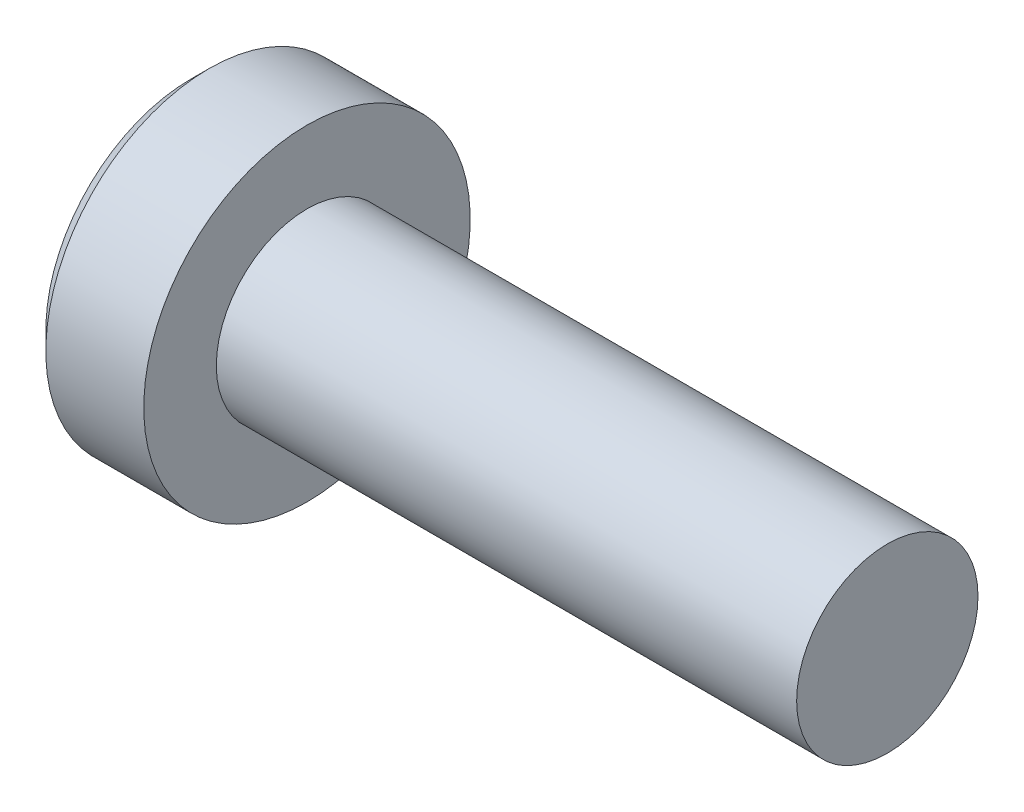
ISO-10303-21;
HEADER;
FILE_DESCRIPTION(('STEP AP214'),'2;1');
FILE_NAME('part.step','',(''),(''),'','','');
FILE_SCHEMA(('AUTOMOTIVE_DESIGN { 1 0 10303 214 1 1 1 1 }'));
ENDSEC;
DATA;
#1=APPLICATION_CONTEXT('core data for automotive mechanical design processes');
#2=APPLICATION_PROTOCOL_DEFINITION('international standard','automotive_design',2000,#1);
#3=PRODUCT_CONTEXT('',#1,'mechanical');
#4=PRODUCT('Part','Part','',(#3));
#5=PRODUCT_RELATED_PRODUCT_CATEGORY('part','',(#4));
#6=PRODUCT_DEFINITION_FORMATION('','',#4);
#7=PRODUCT_DEFINITION_CONTEXT('part definition',#1,'design');
#8=PRODUCT_DEFINITION('design','',#6,#7);
#9=PRODUCT_DEFINITION_SHAPE('','',#8);
#10=(LENGTH_UNIT() NAMED_UNIT(*) SI_UNIT(.MILLI.,.METRE.));
#11=(NAMED_UNIT(*) PLANE_ANGLE_UNIT() SI_UNIT($,.RADIAN.));
#12=(NAMED_UNIT(*) SI_UNIT($,.STERADIAN.) SOLID_ANGLE_UNIT());
#13=UNCERTAINTY_MEASURE_WITH_UNIT(LENGTH_MEASURE(1.E-05),#10,'distance_accuracy_value','');
#14=(GEOMETRIC_REPRESENTATION_CONTEXT(3) GLOBAL_UNCERTAINTY_ASSIGNED_CONTEXT((#13)) GLOBAL_UNIT_ASSIGNED_CONTEXT((#10,
#11,#12)) REPRESENTATION_CONTEXT('',''));
#15=CARTESIAN_POINT('',(0.,0.,0.));
#16=DIRECTION('',(0.,0.,1.));
#17=DIRECTION('',(1.,0.,0.));
#18=AXIS2_PLACEMENT_3D('',#15,#16,#17);
#19=CARTESIAN_POINT('',(-0.5,0.,0.));
#20=DIRECTION('',(-1.,0.,0.));
#21=DIRECTION('',(0.,0.,1.));
#22=AXIS2_PLACEMENT_3D('',#19,#20,#21);
#23=PLANE('',#22);
#24=CARTESIAN_POINT('',(-0.5,0.,0.));
#25=DIRECTION('',(-1.,0.,0.));
#26=DIRECTION('',(0.,-1.,0.));
#27=AXIS2_PLACEMENT_3D('',#24,#25,#26);
#28=CIRCLE('',#27,1.);
#29=CARTESIAN_POINT('',(-0.5,-0.866025403784439,0.5));
#30=VERTEX_POINT('',#29);
#31=CARTESIAN_POINT('',(-0.5,0.,1.));
#32=VERTEX_POINT('',#31);
#33=EDGE_CURVE('E185',#30,#32,#28,.T.);
#34=ORIENTED_EDGE('',*,*,#33,.F.);
#35=DIRECTION('',(0.,0.5,0.866025403784439));
#36=VECTOR('',#35,1.);
#37=CARTESIAN_POINT('',(-0.5,-1.15470053837925,0.));
#38=LINE('',#37,#36);
#39=CARTESIAN_POINT('',(-0.5,-0.577350269189627,0.999999999999999));
#40=VERTEX_POINT('',#39);
#41=EDGE_CURVE('E245',#30,#40,#38,.T.);
#42=ORIENTED_EDGE('',*,*,#41,.T.);
#43=DIRECTION('',(0.,1.,0.));
#44=VECTOR('',#43,1.);
#45=CARTESIAN_POINT('',(-0.5,-0.577350269189627,0.999999999999999));
#46=LINE('',#45,#44);
#47=EDGE_CURVE('E204',#40,#32,#46,.T.);
#48=ORIENTED_EDGE('',*,*,#47,.T.);
#49=EDGE_LOOP('',(#34,#42,#48));
#50=FACE_BOUND('',#49,.T.);
#51=ADVANCED_FACE('F36',(#50),#23,.T.);
#52=CARTESIAN_POINT('',(-0.5,0.866025403784439,0.5));
#53=VERTEX_POINT('',#52);
#54=EDGE_CURVE('E191',#32,#53,#28,.T.);
#55=ORIENTED_EDGE('',*,*,#54,.F.);
#56=CARTESIAN_POINT('',(-0.5,0.577350269189627,0.999999999999999));
#57=VERTEX_POINT('',#56);
#58=EDGE_CURVE('E238',#32,#57,#46,.T.);
#59=ORIENTED_EDGE('',*,*,#58,.T.);
#60=DIRECTION('',(0.,0.5,-0.866025403784439));
#61=VECTOR('',#60,1.);
#62=CARTESIAN_POINT('',(-0.5,0.577350269189627,0.999999999999999));
#63=LINE('',#62,#61);
#64=EDGE_CURVE('E259',#57,#53,#63,.T.);
#65=ORIENTED_EDGE('',*,*,#64,.T.);
#66=EDGE_LOOP('',(#55,#59,#65));
#67=FACE_BOUND('',#66,.T.);
#68=ADVANCED_FACE('F123',(#67),#23,.T.);
#69=CARTESIAN_POINT('',(-0.5,0.866025403784439,-0.5));
#70=VERTEX_POINT('',#69);
#71=EDGE_CURVE('E193',#53,#70,#28,.T.);
#72=ORIENTED_EDGE('',*,*,#71,.F.);
#73=CARTESIAN_POINT('',(-0.5,1.15470053837925,0.));
#74=VERTEX_POINT('',#73);
#75=EDGE_CURVE('E218',#53,#74,#63,.T.);
#76=ORIENTED_EDGE('',*,*,#75,.T.);
#77=DIRECTION('',(0.,-0.5,-0.866025403784439));
#78=VECTOR('',#77,1.);
#79=CARTESIAN_POINT('',(-0.5,1.15470053837925,0.));
#80=LINE('',#79,#78);
#81=EDGE_CURVE('E256',#74,#70,#80,.T.);
#82=ORIENTED_EDGE('',*,*,#81,.T.);
#83=EDGE_LOOP('',(#72,#76,#82));
#84=FACE_BOUND('',#83,.T.);
#85=ADVANCED_FACE('F128',(#84),#23,.T.);
#86=CARTESIAN_POINT('',(-0.5,0.,-1.));
#87=VERTEX_POINT('',#86);
#88=EDGE_CURVE('E196',#70,#87,#28,.T.);
#89=ORIENTED_EDGE('',*,*,#88,.F.);
#90=CARTESIAN_POINT('',(-0.5,0.577350269189626,-1.));
#91=VERTEX_POINT('',#90);
#92=EDGE_CURVE('E258',#70,#91,#80,.T.);
#93=ORIENTED_EDGE('',*,*,#92,.T.);
#94=DIRECTION('',(0.,-1.,0.));
#95=VECTOR('',#94,1.);
#96=CARTESIAN_POINT('',(-0.5,0.577350269189626,-1.));
#97=LINE('',#96,#95);
#98=EDGE_CURVE('E252',#91,#87,#97,.T.);
#99=ORIENTED_EDGE('',*,*,#98,.T.);
#100=EDGE_LOOP('',(#89,#93,#99));
#101=FACE_BOUND('',#100,.T.);
#102=ADVANCED_FACE('F175',(#101),#23,.T.);
#103=CARTESIAN_POINT('',(-0.5,-0.866025403784439,-0.5));
#104=VERTEX_POINT('',#103);
#105=EDGE_CURVE('E51',#87,#104,#28,.T.);
#106=ORIENTED_EDGE('',*,*,#105,.F.);
#107=CARTESIAN_POINT('',(-0.5,-0.577350269189626,-1.));
#108=VERTEX_POINT('',#107);
#109=EDGE_CURVE('E255',#87,#108,#97,.T.);
#110=ORIENTED_EDGE('',*,*,#109,.T.);
#111=DIRECTION('',(0.,-0.5,0.866025403784439));
#112=VECTOR('',#111,1.);
#113=CARTESIAN_POINT('',(-0.5,-0.577350269189626,-1.));
#114=LINE('',#113,#112);
#115=EDGE_CURVE('E247',#108,#104,#114,.T.);
#116=ORIENTED_EDGE('',*,*,#115,.T.);
#117=EDGE_LOOP('',(#106,#110,#116));
#118=FACE_BOUND('',#117,.T.);
#119=ADVANCED_FACE('F121',(#118),#23,.T.);
#120=CARTESIAN_POINT('',(8.,0.,0.));
#121=DIRECTION('',(-1.,0.,0.));
#122=DIRECTION('',(0.,-1.,0.));
#123=AXIS2_PLACEMENT_3D('',#120,#121,#122);
#124=PLANE('',#123);
#125=CARTESIAN_POINT('',(8.,0.,0.));
#126=DIRECTION('',(-1.,0.,0.));
#127=DIRECTION('',(0.,-1.,0.));
#128=AXIS2_PLACEMENT_3D('',#125,#126,#127);
#129=CIRCLE('',#128,1.25);
#130=CARTESIAN_POINT('',(8.,-1.25,0.));
#131=VERTEX_POINT('',#130);
#132=EDGE_CURVE('E179',#131,#131,#129,.T.);
#133=ORIENTED_EDGE('',*,*,#132,.F.);
#134=EDGE_LOOP('',(#133));
#135=FACE_BOUND('',#134,.T.);
#136=ADVANCED_FACE('F168',(#135),#124,.F.);
#137=CARTESIAN_POINT('',(-1.6,0.,0.));
#138=DIRECTION('',(-1.,0.,0.));
#139=DIRECTION('',(0.,-1.,0.));
#140=AXIS2_PLACEMENT_3D('',#137,#138,#139);
#141=CYLINDRICAL_SURFACE('',#140,1.25);
#142=CARTESIAN_POINT('',(0.,0.,0.));
#143=DIRECTION('',(-1.,0.,0.));
#144=DIRECTION('',(0.,-1.,0.));
#145=AXIS2_PLACEMENT_3D('',#142,#143,#144);
#146=CIRCLE('',#145,1.25);
#147=CARTESIAN_POINT('',(0.,-1.25,0.));
#148=VERTEX_POINT('',#147);
#149=EDGE_CURVE('E182',#148,#148,#146,.T.);
#150=ORIENTED_EDGE('',*,*,#149,.F.);
#151=EDGE_LOOP('',(#150));
#152=FACE_BOUND('',#151,.T.);
#153=ORIENTED_EDGE('',*,*,#132,.T.);
#154=EDGE_LOOP('',(#153));
#155=FACE_BOUND('',#154,.T.);
#156=ADVANCED_FACE('F165',(#152,#155),#141,.T.);
#157=CARTESIAN_POINT('',(0.,1.25,0.));
#158=DIRECTION('',(-1.,0.,0.));
#159=DIRECTION('',(0.,-1.,0.));
#160=AXIS2_PLACEMENT_3D('',#157,#158,#159);
#161=PLANE('',#160);
#162=CARTESIAN_POINT('',(0.,0.,0.));
#163=DIRECTION('',(-1.,0.,0.));
#164=DIRECTION('',(0.,-1.,0.));
#165=AXIS2_PLACEMENT_3D('',#162,#163,#164);
#166=CIRCLE('',#165,2.25);
#167=CARTESIAN_POINT('',(0.,-2.25,0.));
#168=VERTEX_POINT('',#167);
#169=EDGE_CURVE('E187',#168,#168,#166,.T.);
#170=ORIENTED_EDGE('',*,*,#169,.F.);
#171=EDGE_LOOP('',(#170));
#172=FACE_BOUND('',#171,.T.);
#173=ORIENTED_EDGE('',*,*,#149,.T.);
#174=EDGE_LOOP('',(#173));
#175=FACE_BOUND('',#174,.T.);
#176=ADVANCED_FACE('F161',(#172,#175),#161,.F.);
#177=CARTESIAN_POINT('',(-1.6,0.,0.));
#178=DIRECTION('',(-1.,0.,0.));
#179=DIRECTION('',(0.,-1.,0.));
#180=AXIS2_PLACEMENT_3D('',#177,#178,#179);
#181=CYLINDRICAL_SURFACE('',#180,2.25);
#182=CARTESIAN_POINT('',(-1.35,0.,0.));
#183=DIRECTION('',(1.,0.,0.));
#184=DIRECTION('',(0.,1.,0.));
#185=AXIS2_PLACEMENT_3D('',#182,#183,#184);
#186=CIRCLE('',#185,2.25);
#187=CARTESIAN_POINT('',(-1.35,2.25,0.));
#188=VERTEX_POINT('',#187);
#189=EDGE_CURVE('E11',#188,#188,#186,.T.);
#190=ORIENTED_EDGE('',*,*,#189,.T.);
#191=EDGE_LOOP('',(#190));
#192=FACE_BOUND('',#191,.T.);
#193=ORIENTED_EDGE('',*,*,#169,.T.);
#194=EDGE_LOOP('',(#193));
#195=FACE_BOUND('',#194,.T.);
#196=ADVANCED_FACE('F157',(#192,#195),#181,.T.);
#197=CARTESIAN_POINT('',(-1.6,2.25,0.));
#198=DIRECTION('',(1.,0.,0.));
#199=DIRECTION('',(0.,1.,0.));
#200=AXIS2_PLACEMENT_3D('',#197,#198,#199);
#201=PLANE('',#200);
#202=CARTESIAN_POINT('',(-1.6,0.,0.));
#203=DIRECTION('',(1.,0.,0.));
#204=DIRECTION('',(0.,1.,0.));
#205=AXIS2_PLACEMENT_3D('',#202,#203,#204);
#206=CIRCLE('',#205,2.);
#207=CARTESIAN_POINT('',(-1.6,2.,0.));
#208=VERTEX_POINT('',#207);
#209=EDGE_CURVE('E44',#208,#208,#206,.F.);
#210=ORIENTED_EDGE('',*,*,#209,.T.);
#211=EDGE_LOOP('',(#210));
#212=FACE_BOUND('',#211,.T.);
#213=DIRECTION('',(0.,-0.5,-0.866025403784439));
#214=VECTOR('',#213,1.);
#215=CARTESIAN_POINT('',(-1.6,1.15470053837925,0.));
#216=LINE('',#215,#214);
#217=CARTESIAN_POINT('',(-1.6,1.15470053837925,0.));
#218=VERTEX_POINT('',#217);
#219=CARTESIAN_POINT('',(-1.6,0.577350269189626,-1.));
#220=VERTEX_POINT('',#219);
#221=EDGE_CURVE('E198',#218,#220,#216,.T.);
#222=ORIENTED_EDGE('',*,*,#221,.F.);
#223=DIRECTION('',(0.,0.5,-0.866025403784439));
#224=VECTOR('',#223,1.);
#225=CARTESIAN_POINT('',(-1.6,0.577350269189627,0.999999999999999));
#226=LINE('',#225,#224);
#227=CARTESIAN_POINT('',(-1.6,0.577350269189627,0.999999999999999));
#228=VERTEX_POINT('',#227);
#229=EDGE_CURVE('E59',#228,#218,#226,.T.);
#230=ORIENTED_EDGE('',*,*,#229,.F.);
#231=DIRECTION('',(0.,1.,0.));
#232=VECTOR('',#231,1.);
#233=CARTESIAN_POINT('',(-1.6,-0.577350269189627,0.999999999999999));
#234=LINE('',#233,#232);
#235=CARTESIAN_POINT('',(-1.6,-0.577350269189627,0.999999999999999));
#236=VERTEX_POINT('',#235);
#237=EDGE_CURVE('E215',#236,#228,#234,.T.);
#238=ORIENTED_EDGE('',*,*,#237,.F.);
#239=DIRECTION('',(0.,0.5,0.866025403784439));
#240=VECTOR('',#239,1.);
#241=CARTESIAN_POINT('',(-1.6,-1.15470053837925,0.));
#242=LINE('',#241,#240);
#243=CARTESIAN_POINT('',(-1.6,-1.15470053837925,0.));
#244=VERTEX_POINT('',#243);
#245=EDGE_CURVE('E212',#244,#236,#242,.T.);
#246=ORIENTED_EDGE('',*,*,#245,.F.);
#247=DIRECTION('',(0.,-0.5,0.866025403784439));
#248=VECTOR('',#247,1.);
#249=CARTESIAN_POINT('',(-1.6,-0.577350269189626,-1.));
#250=LINE('',#249,#248);
#251=CARTESIAN_POINT('',(-1.6,-0.577350269189626,-1.));
#252=VERTEX_POINT('',#251);
#253=EDGE_CURVE('E209',#252,#244,#250,.T.);
#254=ORIENTED_EDGE('',*,*,#253,.F.);
#255=DIRECTION('',(0.,-1.,0.));
#256=VECTOR('',#255,1.);
#257=CARTESIAN_POINT('',(-1.6,0.577350269189626,-1.));
#258=LINE('',#257,#256);
#259=EDGE_CURVE('E201',#220,#252,#258,.T.);
#260=ORIENTED_EDGE('',*,*,#259,.F.);
#261=EDGE_LOOP('',(#222,#230,#238,#246,#254,#260));
#262=FACE_BOUND('',#261,.T.);
#263=ADVANCED_FACE('F154',(#212,#262),#201,.F.);
#264=CARTESIAN_POINT('',(-0.5,0.577350269189627,0.999999999999999));
#265=DIRECTION('',(0.,0.866025403784439,0.5));
#266=DIRECTION('',(0.,-0.5,0.866025403784439));
#267=AXIS2_PLACEMENT_3D('',#264,#265,#266);
#268=PLANE('',#267);
#269=ORIENTED_EDGE('',*,*,#229,.T.);
#270=DIRECTION('',(-1.,0.,0.));
#271=VECTOR('',#270,1.);
#272=CARTESIAN_POINT('',(-0.5,1.15470053837925,0.));
#273=LINE('',#272,#271);
#274=EDGE_CURVE('E229',#74,#218,#273,.T.);
#275=ORIENTED_EDGE('',*,*,#274,.F.);
#276=ORIENTED_EDGE('',*,*,#75,.F.);
#277=ORIENTED_EDGE('',*,*,#64,.F.);
#278=DIRECTION('',(-1.,0.,0.));
#279=VECTOR('',#278,1.);
#280=CARTESIAN_POINT('',(-0.5,0.577350269189627,0.999999999999999));
#281=LINE('',#280,#279);
#282=EDGE_CURVE('E219',#57,#228,#281,.T.);
#283=ORIENTED_EDGE('',*,*,#282,.T.);
#284=EDGE_LOOP('',(#269,#275,#276,#277,#283));
#285=FACE_BOUND('',#284,.T.);
#286=ADVANCED_FACE('F136',(#285),#268,.F.);
#287=CARTESIAN_POINT('',(-0.5,-0.577350269189627,0.999999999999999));
#288=DIRECTION('',(0.,0.,1.));
#289=DIRECTION('',(0.,-1.,0.));
#290=AXIS2_PLACEMENT_3D('',#287,#288,#289);
#291=PLANE('',#290);
#292=ORIENTED_EDGE('',*,*,#237,.T.);
#293=ORIENTED_EDGE('',*,*,#282,.F.);
#294=ORIENTED_EDGE('',*,*,#58,.F.);
#295=ORIENTED_EDGE('',*,*,#47,.F.);
#296=DIRECTION('',(-1.,0.,0.));
#297=VECTOR('',#296,1.);
#298=CARTESIAN_POINT('',(-0.5,-0.577350269189627,0.999999999999999));
#299=LINE('',#298,#297);
#300=EDGE_CURVE('E221',#40,#236,#299,.T.);
#301=ORIENTED_EDGE('',*,*,#300,.T.);
#302=EDGE_LOOP('',(#292,#293,#294,#295,#301));
#303=FACE_BOUND('',#302,.T.);
#304=ADVANCED_FACE('F132',(#303),#291,.F.);
#305=CARTESIAN_POINT('',(-0.5,-1.15470053837925,0.));
#306=DIRECTION('',(0.,-0.866025403784439,0.5));
#307=DIRECTION('',(0.,-0.5,-0.866025403784439));
#308=AXIS2_PLACEMENT_3D('',#305,#306,#307);
#309=PLANE('',#308);
#310=ORIENTED_EDGE('',*,*,#245,.T.);
#311=ORIENTED_EDGE('',*,*,#300,.F.);
#312=ORIENTED_EDGE('',*,*,#41,.F.);
#313=CARTESIAN_POINT('',(-0.5,-1.15470053837925,0.));
#314=VERTEX_POINT('',#313);
#315=EDGE_CURVE('E240',#314,#30,#38,.T.);
#316=ORIENTED_EDGE('',*,*,#315,.F.);
#317=DIRECTION('',(-1.,0.,0.));
#318=VECTOR('',#317,1.);
#319=CARTESIAN_POINT('',(-0.5,-1.15470053837925,0.));
#320=LINE('',#319,#318);
#321=EDGE_CURVE('E223',#314,#244,#320,.T.);
#322=ORIENTED_EDGE('',*,*,#321,.T.);
#323=EDGE_LOOP('',(#310,#311,#312,#316,#322));
#324=FACE_BOUND('',#323,.T.);
#325=ADVANCED_FACE('F135',(#324),#309,.F.);
#326=CARTESIAN_POINT('',(-0.5,-0.577350269189626,-1.));
#327=DIRECTION('',(0.,-0.866025403784439,-0.5));
#328=DIRECTION('',(0.,0.5,-0.866025403784439));
#329=AXIS2_PLACEMENT_3D('',#326,#327,#328);
#330=PLANE('',#329);
#331=ORIENTED_EDGE('',*,*,#253,.T.);
#332=ORIENTED_EDGE('',*,*,#321,.F.);
#333=EDGE_CURVE('E251',#104,#314,#114,.T.);
#334=ORIENTED_EDGE('',*,*,#333,.F.);
#335=ORIENTED_EDGE('',*,*,#115,.F.);
#336=DIRECTION('',(-1.,0.,0.));
#337=VECTOR('',#336,1.);
#338=CARTESIAN_POINT('',(-0.5,-0.577350269189626,-1.));
#339=LINE('',#338,#337);
#340=EDGE_CURVE('E225',#108,#252,#339,.T.);
#341=ORIENTED_EDGE('',*,*,#340,.T.);
#342=EDGE_LOOP('',(#331,#332,#334,#335,#341));
#343=FACE_BOUND('',#342,.T.);
#344=ADVANCED_FACE('F140',(#343),#330,.F.);
#345=CARTESIAN_POINT('',(-0.5,0.577350269189626,-1.));
#346=DIRECTION('',(0.,0.,-1.));
#347=DIRECTION('',(0.,1.,0.));
#348=AXIS2_PLACEMENT_3D('',#345,#346,#347);
#349=PLANE('',#348);
#350=ORIENTED_EDGE('',*,*,#259,.T.);
#351=ORIENTED_EDGE('',*,*,#340,.F.);
#352=ORIENTED_EDGE('',*,*,#109,.F.);
#353=ORIENTED_EDGE('',*,*,#98,.F.);
#354=DIRECTION('',(-1.,0.,0.));
#355=VECTOR('',#354,1.);
#356=CARTESIAN_POINT('',(-0.5,0.577350269189626,-1.));
#357=LINE('',#356,#355);
#358=EDGE_CURVE('E227',#91,#220,#357,.T.);
#359=ORIENTED_EDGE('',*,*,#358,.T.);
#360=EDGE_LOOP('',(#350,#351,#352,#353,#359));
#361=FACE_BOUND('',#360,.T.);
#362=ADVANCED_FACE('F144',(#361),#349,.F.);
#363=CARTESIAN_POINT('',(-0.5,1.15470053837925,0.));
#364=DIRECTION('',(0.,0.866025403784439,-0.5));
#365=DIRECTION('',(0.,0.5,0.866025403784439));
#366=AXIS2_PLACEMENT_3D('',#363,#364,#365);
#367=PLANE('',#366);
#368=ORIENTED_EDGE('',*,*,#221,.T.);
#369=ORIENTED_EDGE('',*,*,#358,.F.);
#370=ORIENTED_EDGE('',*,*,#92,.F.);
#371=ORIENTED_EDGE('',*,*,#81,.F.);
#372=ORIENTED_EDGE('',*,*,#274,.T.);
#373=EDGE_LOOP('',(#368,#369,#370,#371,#372));
#374=FACE_BOUND('',#373,.T.);
#375=ADVANCED_FACE('F118',(#374),#367,.F.);
#376=EDGE_CURVE('E181',#104,#30,#28,.T.);
#377=ORIENTED_EDGE('',*,*,#376,.F.);
#378=ORIENTED_EDGE('',*,*,#333,.T.);
#379=ORIENTED_EDGE('',*,*,#315,.T.);
#380=EDGE_LOOP('',(#377,#378,#379));
#381=FACE_BOUND('',#380,.T.);
#382=ADVANCED_FACE('F111',(#381),#23,.T.);
#383=CARTESIAN_POINT('',(0.0773502691896188,0.,0.));
#384=DIRECTION('',(-1.,0.,0.));
#385=DIRECTION('',(0.,-1.,0.));
#386=AXIS2_PLACEMENT_3D('',#383,#384,#385);
#387=CONICAL_SURFACE('',#386,0.,1.0471975511966);
#388=ORIENTED_EDGE('',*,*,#33,.T.);
#389=ORIENTED_EDGE('',*,*,#54,.T.);
#390=ORIENTED_EDGE('',*,*,#71,.T.);
#391=ORIENTED_EDGE('',*,*,#88,.T.);
#392=ORIENTED_EDGE('',*,*,#105,.T.);
#393=ORIENTED_EDGE('',*,*,#376,.T.);
#394=EDGE_LOOP('',(#388,#389,#390,#391,#392,#393));
#395=FACE_BOUND('',#394,.T.);
#396=CARTESIAN_POINT('',(0.0773502691896188,0.,0.));
#397=VERTEX_POINT('',#396);
#398=VERTEX_LOOP('',#397);
#399=FACE_BOUND('',#398,.T.);
#400=ADVANCED_FACE('F109',(#395,#399),#387,.F.);
#401=CARTESIAN_POINT('',(-1.6,0.,0.));
#402=DIRECTION('',(1.,0.,0.));
#403=DIRECTION('',(0.,1.,0.));
#404=AXIS2_PLACEMENT_3D('',#401,#402,#403);
#405=CONICAL_SURFACE('',#404,2.,0.785398163397443);
#406=ORIENTED_EDGE('',*,*,#189,.F.);
#407=EDGE_LOOP('',(#406));
#408=FACE_BOUND('',#407,.T.);
#409=ORIENTED_EDGE('',*,*,#209,.F.);
#410=EDGE_LOOP('',(#409));
#411=FACE_BOUND('',#410,.T.);
#412=ADVANCED_FACE('F38',(#408,#411),#405,.T.);
#413=CLOSED_SHELL('',(#51,#68,#85,#102,#119,#136,#156,#176,#196,#263,#286,#304,#325,#344,#362,
#375,#382,#400,#412));
#414=MANIFOLD_SOLID_BREP('B2',#413);
#415=ADVANCED_BREP_SHAPE_REPRESENTATION('',(#18,#414),#14);
#416=SHAPE_DEFINITION_REPRESENTATION(#9,#415);
ENDSEC;
END-ISO-10303-21;
